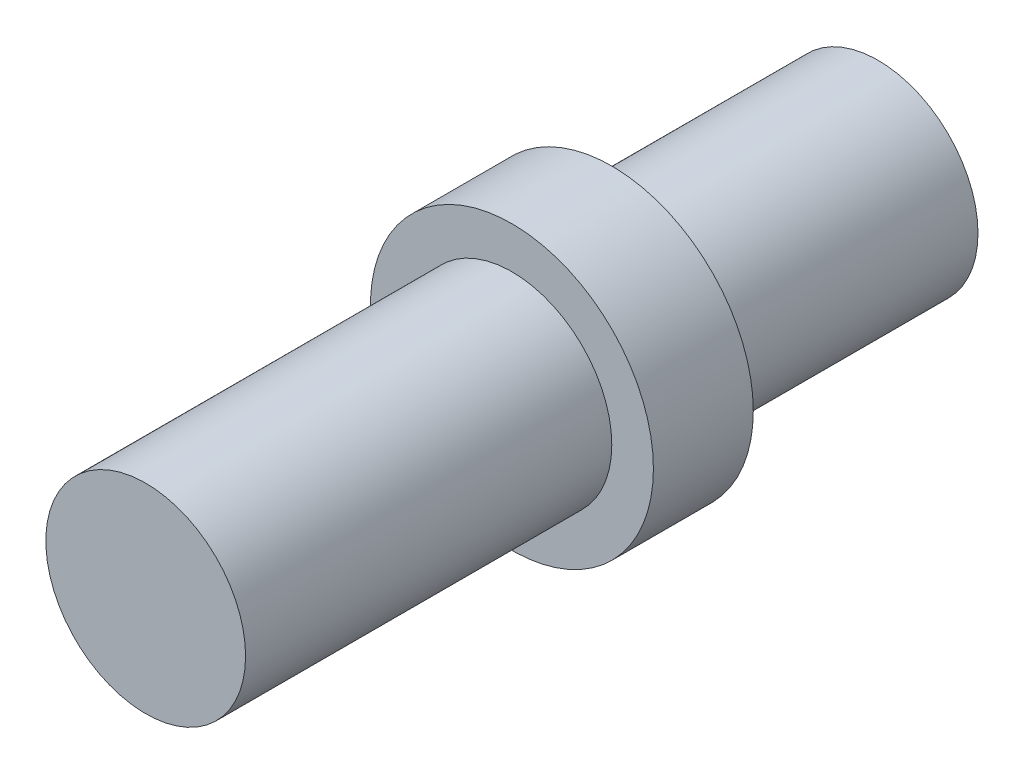
ISO-10303-21;
HEADER;
FILE_DESCRIPTION(('STEP AP214'),'2;1');
FILE_NAME('part.step','',(''),(''),'','','');
FILE_SCHEMA(('AUTOMOTIVE_DESIGN { 1 0 10303 214 1 1 1 1 }'));
ENDSEC;
DATA;
#1=APPLICATION_CONTEXT('core data for automotive mechanical design processes');
#2=APPLICATION_PROTOCOL_DEFINITION('international standard','automotive_design',2000,#1);
#3=PRODUCT_CONTEXT('',#1,'mechanical');
#4=PRODUCT('Part','Part','',(#3));
#5=PRODUCT_RELATED_PRODUCT_CATEGORY('part','',(#4));
#6=PRODUCT_DEFINITION_FORMATION('','',#4);
#7=PRODUCT_DEFINITION_CONTEXT('part definition',#1,'design');
#8=PRODUCT_DEFINITION('design','',#6,#7);
#9=PRODUCT_DEFINITION_SHAPE('','',#8);
#10=(LENGTH_UNIT() NAMED_UNIT(*) SI_UNIT(.MILLI.,.METRE.));
#11=(NAMED_UNIT(*) PLANE_ANGLE_UNIT() SI_UNIT($,.RADIAN.));
#12=(NAMED_UNIT(*) SI_UNIT($,.STERADIAN.) SOLID_ANGLE_UNIT());
#13=UNCERTAINTY_MEASURE_WITH_UNIT(LENGTH_MEASURE(1.E-05),#10,'distance_accuracy_value','');
#14=(GEOMETRIC_REPRESENTATION_CONTEXT(3) GLOBAL_UNCERTAINTY_ASSIGNED_CONTEXT((#13)) GLOBAL_UNIT_ASSIGNED_CONTEXT((#10,
#11,#12)) REPRESENTATION_CONTEXT('',''));
#15=CARTESIAN_POINT('',(0.,0.,0.));
#16=DIRECTION('',(0.,0.,1.));
#17=DIRECTION('',(1.,0.,0.));
#18=AXIS2_PLACEMENT_3D('',#15,#16,#17);
#19=CARTESIAN_POINT('',(0.,0.,44.));
#20=DIRECTION('',(0.,0.,-1.));
#21=DIRECTION('',(-1.,0.,0.));
#22=AXIS2_PLACEMENT_3D('',#19,#20,#21);
#23=CYLINDRICAL_SURFACE('',#22,6.);
#24=CARTESIAN_POINT('',(0.,0.,22.));
#25=DIRECTION('',(0.,0.,1.));
#26=DIRECTION('',(1.,0.,0.));
#27=AXIS2_PLACEMENT_3D('',#24,#25,#26);
#28=CIRCLE('',#27,6.);
#29=CARTESIAN_POINT('',(6.,0.,22.));
#30=VERTEX_POINT('',#29);
#31=EDGE_CURVE('E44',#30,#30,#28,.T.);
#32=ORIENTED_EDGE('',*,*,#31,.T.);
#33=EDGE_LOOP('',(#32));
#34=FACE_BOUND('',#33,.T.);
#35=CARTESIAN_POINT('',(0.,0.,44.));
#36=DIRECTION('',(0.,0.,1.));
#37=DIRECTION('',(1.,0.,0.));
#38=AXIS2_PLACEMENT_3D('',#35,#36,#37);
#39=CIRCLE('',#38,6.);
#40=CARTESIAN_POINT('',(6.,0.,44.));
#41=VERTEX_POINT('',#40);
#42=EDGE_CURVE('E48',#41,#41,#39,.T.);
#43=ORIENTED_EDGE('',*,*,#42,.F.);
#44=EDGE_LOOP('',(#43));
#45=FACE_BOUND('',#44,.T.);
#46=ADVANCED_FACE('F41',(#34,#45),#23,.T.);
#47=CARTESIAN_POINT('',(0.,0.,44.));
#48=DIRECTION('',(0.,0.,1.));
#49=DIRECTION('',(1.,0.,0.));
#50=AXIS2_PLACEMENT_3D('',#47,#48,#49);
#51=PLANE('',#50);
#52=ORIENTED_EDGE('',*,*,#42,.T.);
#53=EDGE_LOOP('',(#52));
#54=FACE_BOUND('',#53,.T.);
#55=ADVANCED_FACE('F80',(#54),#51,.T.);
#56=CARTESIAN_POINT('',(0.,0.,22.));
#57=DIRECTION('',(0.,0.,-1.));
#58=DIRECTION('',(-1.,0.,0.));
#59=AXIS2_PLACEMENT_3D('',#56,#57,#58);
#60=CYLINDRICAL_SURFACE('',#59,8.5);
#61=CARTESIAN_POINT('',(0.,0.,22.));
#62=DIRECTION('',(0.,0.,1.));
#63=DIRECTION('',(1.,0.,0.));
#64=AXIS2_PLACEMENT_3D('',#61,#62,#63);
#65=CIRCLE('',#64,8.5);
#66=CARTESIAN_POINT('',(8.5,0.,22.));
#67=VERTEX_POINT('',#66);
#68=EDGE_CURVE('E60',#67,#67,#65,.T.);
#69=ORIENTED_EDGE('',*,*,#68,.F.);
#70=EDGE_LOOP('',(#69));
#71=FACE_BOUND('',#70,.T.);
#72=CARTESIAN_POINT('',(0.,0.,16.));
#73=DIRECTION('',(0.,0.,1.));
#74=DIRECTION('',(1.,0.,0.));
#75=AXIS2_PLACEMENT_3D('',#72,#73,#74);
#76=CIRCLE('',#75,8.5);
#77=CARTESIAN_POINT('',(8.5,0.,16.));
#78=VERTEX_POINT('',#77);
#79=EDGE_CURVE('E57',#78,#78,#76,.T.);
#80=ORIENTED_EDGE('',*,*,#79,.T.);
#81=EDGE_LOOP('',(#80));
#82=FACE_BOUND('',#81,.T.);
#83=ADVANCED_FACE('F72',(#71,#82),#60,.T.);
#84=CARTESIAN_POINT('',(0.,0.,22.));
#85=DIRECTION('',(0.,0.,1.));
#86=DIRECTION('',(1.,0.,0.));
#87=AXIS2_PLACEMENT_3D('',#84,#85,#86);
#88=PLANE('',#87);
#89=ORIENTED_EDGE('',*,*,#31,.F.);
#90=EDGE_LOOP('',(#89));
#91=FACE_BOUND('',#90,.T.);
#92=ORIENTED_EDGE('',*,*,#68,.T.);
#93=EDGE_LOOP('',(#92));
#94=FACE_BOUND('',#93,.T.);
#95=ADVANCED_FACE('F69',(#91,#94),#88,.T.);
#96=CARTESIAN_POINT('',(0.,0.,16.));
#97=DIRECTION('',(0.,0.,1.));
#98=DIRECTION('',(1.,0.,0.));
#99=AXIS2_PLACEMENT_3D('',#96,#97,#98);
#100=PLANE('',#99);
#101=CARTESIAN_POINT('',(0.,0.,16.));
#102=DIRECTION('',(0.,0.,1.));
#103=DIRECTION('',(1.,0.,0.));
#104=AXIS2_PLACEMENT_3D('',#101,#102,#103);
#105=CIRCLE('',#104,6.);
#106=CARTESIAN_POINT('',(6.,0.,16.));
#107=VERTEX_POINT('',#106);
#108=EDGE_CURVE('E10',#107,#107,#105,.T.);
#109=ORIENTED_EDGE('',*,*,#108,.T.);
#110=EDGE_LOOP('',(#109));
#111=FACE_BOUND('',#110,.T.);
#112=ORIENTED_EDGE('',*,*,#79,.F.);
#113=EDGE_LOOP('',(#112));
#114=FACE_BOUND('',#113,.T.);
#115=ADVANCED_FACE('F71',(#111,#114),#100,.F.);
#116=CARTESIAN_POINT('',(0.,0.,0.));
#117=DIRECTION('',(0.,0.,1.));
#118=DIRECTION('',(1.,0.,0.));
#119=AXIS2_PLACEMENT_3D('',#116,#117,#118);
#120=PLANE('',#119);
#121=CARTESIAN_POINT('',(0.,0.,0.));
#122=DIRECTION('',(0.,0.,1.));
#123=DIRECTION('',(1.,0.,0.));
#124=AXIS2_PLACEMENT_3D('',#121,#122,#123);
#125=CIRCLE('',#124,6.);
#126=CARTESIAN_POINT('',(6.,0.,0.));
#127=VERTEX_POINT('',#126);
#128=EDGE_CURVE('E52',#127,#127,#125,.T.);
#129=ORIENTED_EDGE('',*,*,#128,.F.);
#130=EDGE_LOOP('',(#129));
#131=FACE_BOUND('',#130,.T.);
#132=ADVANCED_FACE('F78',(#131),#120,.F.);
#133=ORIENTED_EDGE('',*,*,#128,.T.);
#134=EDGE_LOOP('',(#133));
#135=FACE_BOUND('',#134,.T.);
#136=ORIENTED_EDGE('',*,*,#108,.F.);
#137=EDGE_LOOP('',(#136));
#138=FACE_BOUND('',#137,.T.);
#139=ADVANCED_FACE('F84',(#135,#138),#23,.T.);
#140=CLOSED_SHELL('',(#46,#55,#83,#95,#115,#132,#139));
#141=MANIFOLD_SOLID_BREP('B2',#140);
#142=ADVANCED_BREP_SHAPE_REPRESENTATION('',(#18,#141),#14);
#143=SHAPE_DEFINITION_REPRESENTATION(#9,#142);
ENDSEC;
END-ISO-10303-21;
